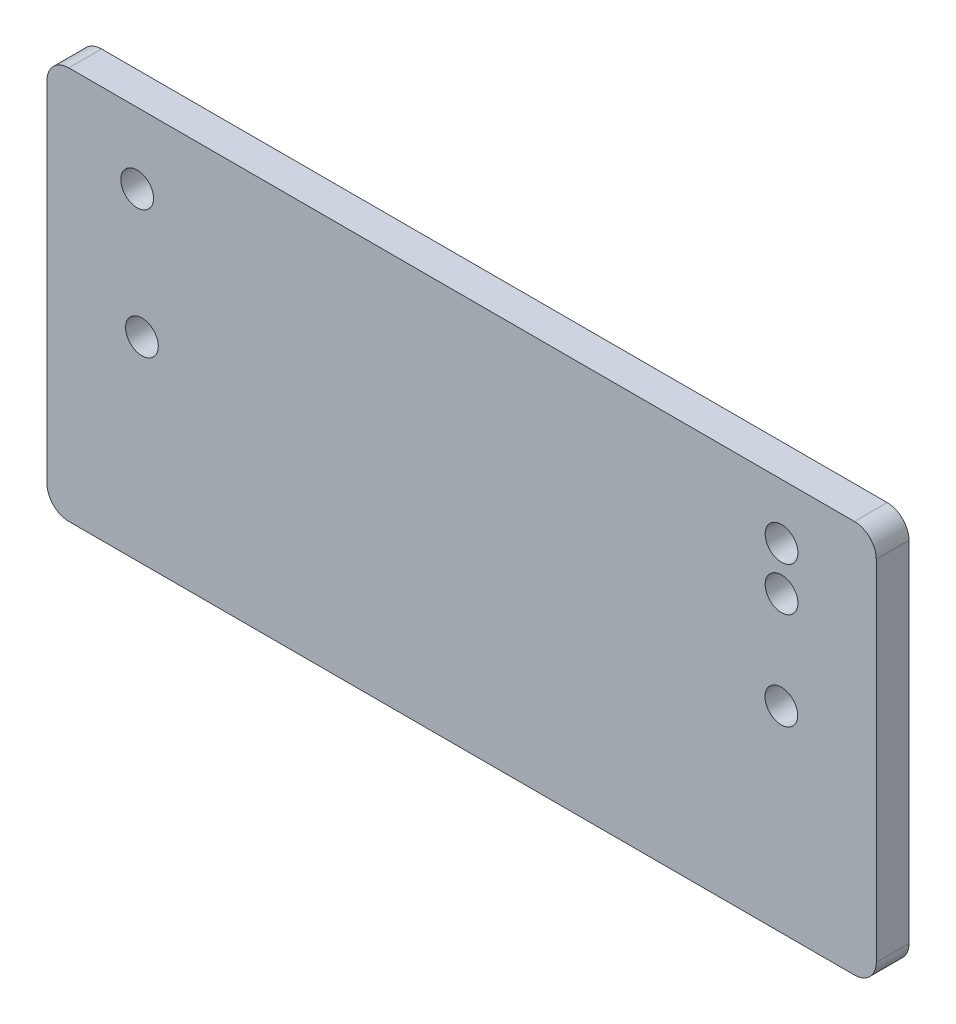
ISO-10303-21;
HEADER;
FILE_DESCRIPTION(('STEP AP214'),'2;1');
FILE_NAME('part.step','',(''),(''),'','','');
FILE_SCHEMA(('AUTOMOTIVE_DESIGN { 1 0 10303 214 1 1 1 1 }'));
ENDSEC;
DATA;
#1=APPLICATION_CONTEXT('core data for automotive mechanical design processes');
#2=APPLICATION_PROTOCOL_DEFINITION('international standard','automotive_design',2000,#1);
#3=PRODUCT_CONTEXT('',#1,'mechanical');
#4=PRODUCT('Part','Part','',(#3));
#5=PRODUCT_RELATED_PRODUCT_CATEGORY('part','',(#4));
#6=PRODUCT_DEFINITION_FORMATION('','',#4);
#7=PRODUCT_DEFINITION_CONTEXT('part definition',#1,'design');
#8=PRODUCT_DEFINITION('design','',#6,#7);
#9=PRODUCT_DEFINITION_SHAPE('','',#8);
#10=(LENGTH_UNIT() NAMED_UNIT(*) SI_UNIT(.MILLI.,.METRE.));
#11=(NAMED_UNIT(*) PLANE_ANGLE_UNIT() SI_UNIT($,.RADIAN.));
#12=(NAMED_UNIT(*) SI_UNIT($,.STERADIAN.) SOLID_ANGLE_UNIT());
#13=UNCERTAINTY_MEASURE_WITH_UNIT(LENGTH_MEASURE(1.E-05),#10,'distance_accuracy_value','');
#14=(GEOMETRIC_REPRESENTATION_CONTEXT(3) GLOBAL_UNCERTAINTY_ASSIGNED_CONTEXT((#13)) GLOBAL_UNIT_ASSIGNED_CONTEXT((#10,
#11,#12)) REPRESENTATION_CONTEXT('',''));
#15=CARTESIAN_POINT('',(0.,0.,0.));
#16=DIRECTION('',(0.,0.,1.));
#17=DIRECTION('',(1.,0.,0.));
#18=AXIS2_PLACEMENT_3D('',#15,#16,#17);
#19=CARTESIAN_POINT('',(40.6759171383149,-2.,3.));
#20=DIRECTION('',(0.,0.,-1.));
#21=DIRECTION('',(-1.,0.,0.));
#22=AXIS2_PLACEMENT_3D('',#19,#20,#21);
#23=CYLINDRICAL_SURFACE('',#22,2.);
#24=CARTESIAN_POINT('',(40.6759171383149,-2.,0.));
#25=DIRECTION('',(0.,0.,1.));
#26=DIRECTION('',(-1.,0.,0.));
#27=AXIS2_PLACEMENT_3D('',#24,#25,#26);
#28=CIRCLE('',#27,2.);
#29=CARTESIAN_POINT('',(42.6759171383149,-2.00000000000001,0.));
#30=VERTEX_POINT('',#29);
#31=CARTESIAN_POINT('',(40.6759171383149,0.,0.));
#32=VERTEX_POINT('',#31);
#33=EDGE_CURVE('E141',#30,#32,#28,.T.);
#34=ORIENTED_EDGE('',*,*,#33,.T.);
#35=DIRECTION('',(0.,0.,-1.));
#36=VECTOR('',#35,1.);
#37=CARTESIAN_POINT('',(40.6759171383149,0.,3.));
#38=LINE('',#37,#36);
#39=CARTESIAN_POINT('',(40.6759171383149,0.,3.));
#40=VERTEX_POINT('',#39);
#41=EDGE_CURVE('E11',#40,#32,#38,.T.);
#42=ORIENTED_EDGE('',*,*,#41,.F.);
#43=CARTESIAN_POINT('',(40.6759171383149,-2.,3.));
#44=DIRECTION('',(0.,0.,1.));
#45=DIRECTION('',(-1.,0.,0.));
#46=AXIS2_PLACEMENT_3D('',#43,#44,#45);
#47=CIRCLE('',#46,2.);
#48=CARTESIAN_POINT('',(42.6759171383149,-2.00000000000001,3.));
#49=VERTEX_POINT('',#48);
#50=EDGE_CURVE('E156',#49,#40,#47,.T.);
#51=ORIENTED_EDGE('',*,*,#50,.F.);
#52=DIRECTION('',(0.,0.,-1.));
#53=VECTOR('',#52,1.);
#54=CARTESIAN_POINT('',(42.6759171383149,-2.00000000000001,3.));
#55=LINE('',#54,#53);
#56=EDGE_CURVE('E137',#49,#30,#55,.T.);
#57=ORIENTED_EDGE('',*,*,#56,.T.);
#58=EDGE_LOOP('',(#34,#42,#51,#57));
#59=FACE_BOUND('',#58,.T.);
#60=ADVANCED_FACE('F45',(#59),#23,.T.);
#61=CARTESIAN_POINT('',(-31.3240828616851,0.,3.));
#62=DIRECTION('',(0.,-1.,0.));
#63=DIRECTION('',(0.,0.,-1.));
#64=AXIS2_PLACEMENT_3D('',#61,#62,#63);
#65=PLANE('',#64);
#66=DIRECTION('',(-1.,0.,0.));
#67=VECTOR('',#66,1.);
#68=CARTESIAN_POINT('',(-31.3240828616851,0.,0.));
#69=LINE('',#68,#67);
#70=CARTESIAN_POINT('',(-31.3240828616851,0.,0.));
#71=VERTEX_POINT('',#70);
#72=EDGE_CURVE('E144',#32,#71,#69,.T.);
#73=ORIENTED_EDGE('',*,*,#72,.T.);
#74=DIRECTION('',(0.,0.,-1.));
#75=VECTOR('',#74,1.);
#76=CARTESIAN_POINT('',(-31.3240828616851,0.,3.));
#77=LINE('',#76,#75);
#78=CARTESIAN_POINT('',(-31.3240828616851,0.,3.));
#79=VERTEX_POINT('',#78);
#80=EDGE_CURVE('E53',#79,#71,#77,.T.);
#81=ORIENTED_EDGE('',*,*,#80,.F.);
#82=DIRECTION('',(-1.,0.,0.));
#83=VECTOR('',#82,1.);
#84=CARTESIAN_POINT('',(-31.3240828616851,0.,3.));
#85=LINE('',#84,#83);
#86=EDGE_CURVE('E104',#40,#79,#85,.T.);
#87=ORIENTED_EDGE('',*,*,#86,.F.);
#88=ORIENTED_EDGE('',*,*,#41,.T.);
#89=EDGE_LOOP('',(#73,#81,#87,#88));
#90=FACE_BOUND('',#89,.T.);
#91=ADVANCED_FACE('F246',(#90),#65,.F.);
#92=CARTESIAN_POINT('',(-31.3240828616851,-2.,3.));
#93=DIRECTION('',(0.,0.,-1.));
#94=DIRECTION('',(-1.,0.,0.));
#95=AXIS2_PLACEMENT_3D('',#92,#93,#94);
#96=CYLINDRICAL_SURFACE('',#95,2.);
#97=CARTESIAN_POINT('',(-31.3240828616851,-2.,0.));
#98=DIRECTION('',(0.,0.,1.));
#99=DIRECTION('',(-1.,0.,0.));
#100=AXIS2_PLACEMENT_3D('',#97,#98,#99);
#101=CIRCLE('',#100,2.);
#102=CARTESIAN_POINT('',(-33.3240828616851,-2.00000000000001,0.));
#103=VERTEX_POINT('',#102);
#104=EDGE_CURVE('E147',#71,#103,#101,.T.);
#105=ORIENTED_EDGE('',*,*,#104,.T.);
#106=DIRECTION('',(0.,0.,-1.));
#107=VECTOR('',#106,1.);
#108=CARTESIAN_POINT('',(-33.3240828616851,-2.00000000000001,3.));
#109=LINE('',#108,#107);
#110=CARTESIAN_POINT('',(-33.3240828616851,-2.00000000000001,3.));
#111=VERTEX_POINT('',#110);
#112=EDGE_CURVE('E163',#111,#103,#109,.T.);
#113=ORIENTED_EDGE('',*,*,#112,.F.);
#114=CARTESIAN_POINT('',(-31.3240828616851,-2.,3.));
#115=DIRECTION('',(0.,0.,1.));
#116=DIRECTION('',(-1.,0.,0.));
#117=AXIS2_PLACEMENT_3D('',#114,#115,#116);
#118=CIRCLE('',#117,2.);
#119=EDGE_CURVE('E171',#79,#111,#118,.T.);
#120=ORIENTED_EDGE('',*,*,#119,.F.);
#121=ORIENTED_EDGE('',*,*,#80,.T.);
#122=EDGE_LOOP('',(#105,#113,#120,#121));
#123=FACE_BOUND('',#122,.T.);
#124=ADVANCED_FACE('F169',(#123),#96,.T.);
#125=CARTESIAN_POINT('',(-33.3240828616851,-2.00000000000001,3.));
#126=DIRECTION('',(1.,0.,0.));
#127=DIRECTION('',(0.,0.,-1.));
#128=AXIS2_PLACEMENT_3D('',#125,#126,#127);
#129=PLANE('',#128);
#130=DIRECTION('',(0.,-1.,0.));
#131=VECTOR('',#130,1.);
#132=CARTESIAN_POINT('',(-33.3240828616851,-2.00000000000001,0.));
#133=LINE('',#132,#131);
#134=CARTESIAN_POINT('',(-33.3240828616851,-34.,0.));
#135=VERTEX_POINT('',#134);
#136=EDGE_CURVE('E149',#103,#135,#133,.T.);
#137=ORIENTED_EDGE('',*,*,#136,.T.);
#138=DIRECTION('',(0.,0.,-1.));
#139=VECTOR('',#138,1.);
#140=CARTESIAN_POINT('',(-33.3240828616851,-34.,3.));
#141=LINE('',#140,#139);
#142=CARTESIAN_POINT('',(-33.3240828616851,-34.,3.));
#143=VERTEX_POINT('',#142);
#144=EDGE_CURVE('E160',#143,#135,#141,.T.);
#145=ORIENTED_EDGE('',*,*,#144,.F.);
#146=DIRECTION('',(0.,-1.,0.));
#147=VECTOR('',#146,1.);
#148=CARTESIAN_POINT('',(-33.3240828616851,-2.00000000000001,3.));
#149=LINE('',#148,#147);
#150=EDGE_CURVE('E183',#111,#143,#149,.T.);
#151=ORIENTED_EDGE('',*,*,#150,.F.);
#152=ORIENTED_EDGE('',*,*,#112,.T.);
#153=EDGE_LOOP('',(#137,#145,#151,#152));
#154=FACE_BOUND('',#153,.T.);
#155=ADVANCED_FACE('F179',(#154),#129,.F.);
#156=CARTESIAN_POINT('',(-31.3240828616851,-34.,3.));
#157=DIRECTION('',(0.,0.,-1.));
#158=DIRECTION('',(-1.,0.,0.));
#159=AXIS2_PLACEMENT_3D('',#156,#157,#158);
#160=CYLINDRICAL_SURFACE('',#159,2.);
#161=CARTESIAN_POINT('',(-31.3240828616851,-34.,0.));
#162=DIRECTION('',(0.,0.,1.));
#163=DIRECTION('',(-1.,0.,0.));
#164=AXIS2_PLACEMENT_3D('',#161,#162,#163);
#165=CIRCLE('',#164,2.);
#166=CARTESIAN_POINT('',(-31.3240828616851,-36.,0.));
#167=VERTEX_POINT('',#166);
#168=EDGE_CURVE('E151',#135,#167,#165,.T.);
#169=ORIENTED_EDGE('',*,*,#168,.T.);
#170=DIRECTION('',(0.,0.,-1.));
#171=VECTOR('',#170,1.);
#172=CARTESIAN_POINT('',(-31.3240828616851,-36.,3.));
#173=LINE('',#172,#171);
#174=CARTESIAN_POINT('',(-31.3240828616851,-36.,3.));
#175=VERTEX_POINT('',#174);
#176=EDGE_CURVE('E132',#175,#167,#173,.T.);
#177=ORIENTED_EDGE('',*,*,#176,.F.);
#178=CARTESIAN_POINT('',(-31.3240828616851,-34.,3.));
#179=DIRECTION('',(0.,0.,1.));
#180=DIRECTION('',(-1.,0.,0.));
#181=AXIS2_PLACEMENT_3D('',#178,#179,#180);
#182=CIRCLE('',#181,2.);
#183=EDGE_CURVE('E123',#143,#175,#182,.T.);
#184=ORIENTED_EDGE('',*,*,#183,.F.);
#185=ORIENTED_EDGE('',*,*,#144,.T.);
#186=EDGE_LOOP('',(#169,#177,#184,#185));
#187=FACE_BOUND('',#186,.T.);
#188=ADVANCED_FACE('F182',(#187),#160,.T.);
#189=CARTESIAN_POINT('',(-31.3240828616851,-36.,3.));
#190=DIRECTION('',(0.,1.,0.));
#191=DIRECTION('',(0.,0.,1.));
#192=AXIS2_PLACEMENT_3D('',#189,#190,#191);
#193=PLANE('',#192);
#194=DIRECTION('',(1.,0.,0.));
#195=VECTOR('',#194,1.);
#196=CARTESIAN_POINT('',(-31.3240828616851,-36.,0.));
#197=LINE('',#196,#195);
#198=CARTESIAN_POINT('',(40.6759171383149,-36.,0.));
#199=VERTEX_POINT('',#198);
#200=EDGE_CURVE('E131',#167,#199,#197,.T.);
#201=ORIENTED_EDGE('',*,*,#200,.T.);
#202=DIRECTION('',(0.,0.,-1.));
#203=VECTOR('',#202,1.);
#204=CARTESIAN_POINT('',(40.6759171383149,-36.,3.));
#205=LINE('',#204,#203);
#206=CARTESIAN_POINT('',(40.6759171383149,-36.,3.));
#207=VERTEX_POINT('',#206);
#208=EDGE_CURVE('E128',#207,#199,#205,.T.);
#209=ORIENTED_EDGE('',*,*,#208,.F.);
#210=DIRECTION('',(1.,0.,0.));
#211=VECTOR('',#210,1.);
#212=CARTESIAN_POINT('',(-31.3240828616851,-36.,3.));
#213=LINE('',#212,#211);
#214=EDGE_CURVE('E117',#175,#207,#213,.T.);
#215=ORIENTED_EDGE('',*,*,#214,.F.);
#216=ORIENTED_EDGE('',*,*,#176,.T.);
#217=EDGE_LOOP('',(#201,#209,#215,#216));
#218=FACE_BOUND('',#217,.T.);
#219=ADVANCED_FACE('F129',(#218),#193,.F.);
#220=CARTESIAN_POINT('',(40.6759171383149,-34.,3.));
#221=DIRECTION('',(0.,0.,-1.));
#222=DIRECTION('',(-1.,0.,0.));
#223=AXIS2_PLACEMENT_3D('',#220,#221,#222);
#224=CYLINDRICAL_SURFACE('',#223,2.);
#225=CARTESIAN_POINT('',(40.6759171383149,-34.,0.));
#226=DIRECTION('',(0.,0.,1.));
#227=DIRECTION('',(-1.,0.,0.));
#228=AXIS2_PLACEMENT_3D('',#225,#226,#227);
#229=CIRCLE('',#228,2.);
#230=CARTESIAN_POINT('',(42.6759171383149,-34.,0.));
#231=VERTEX_POINT('',#230);
#232=EDGE_CURVE('E90',#199,#231,#229,.T.);
#233=ORIENTED_EDGE('',*,*,#232,.T.);
#234=DIRECTION('',(0.,0.,-1.));
#235=VECTOR('',#234,1.);
#236=CARTESIAN_POINT('',(42.6759171383149,-34.,3.));
#237=LINE('',#236,#235);
#238=CARTESIAN_POINT('',(42.6759171383149,-34.,3.));
#239=VERTEX_POINT('',#238);
#240=EDGE_CURVE('E133',#239,#231,#237,.T.);
#241=ORIENTED_EDGE('',*,*,#240,.F.);
#242=CARTESIAN_POINT('',(40.6759171383149,-34.,3.));
#243=DIRECTION('',(0.,0.,1.));
#244=DIRECTION('',(-1.,0.,0.));
#245=AXIS2_PLACEMENT_3D('',#242,#243,#244);
#246=CIRCLE('',#245,2.);
#247=EDGE_CURVE('E121',#207,#239,#246,.T.);
#248=ORIENTED_EDGE('',*,*,#247,.F.);
#249=ORIENTED_EDGE('',*,*,#208,.T.);
#250=EDGE_LOOP('',(#233,#241,#248,#249));
#251=FACE_BOUND('',#250,.T.);
#252=ADVANCED_FACE('F135',(#251),#224,.T.);
#253=CARTESIAN_POINT('',(42.6759171383149,-34.,3.));
#254=DIRECTION('',(-1.,0.,0.));
#255=DIRECTION('',(0.,0.,1.));
#256=AXIS2_PLACEMENT_3D('',#253,#254,#255);
#257=PLANE('',#256);
#258=DIRECTION('',(0.,1.,0.));
#259=VECTOR('',#258,1.);
#260=CARTESIAN_POINT('',(42.6759171383149,-34.,0.));
#261=LINE('',#260,#259);
#262=EDGE_CURVE('E96',#231,#30,#261,.T.);
#263=ORIENTED_EDGE('',*,*,#262,.T.);
#264=ORIENTED_EDGE('',*,*,#56,.F.);
#265=DIRECTION('',(0.,1.,0.));
#266=VECTOR('',#265,1.);
#267=CARTESIAN_POINT('',(42.6759171383149,-34.,3.));
#268=LINE('',#267,#266);
#269=EDGE_CURVE('E61',#239,#49,#268,.T.);
#270=ORIENTED_EDGE('',*,*,#269,.F.);
#271=ORIENTED_EDGE('',*,*,#240,.T.);
#272=EDGE_LOOP('',(#263,#264,#270,#271));
#273=FACE_BOUND('',#272,.T.);
#274=ADVANCED_FACE('F223',(#273),#257,.F.);
#275=CARTESIAN_POINT('',(40.6759171383149,-2.,3.));
#276=DIRECTION('',(0.,0.,-1.));
#277=DIRECTION('',(-1.,0.,0.));
#278=AXIS2_PLACEMENT_3D('',#275,#276,#277);
#279=PLANE('',#278);
#280=CARTESIAN_POINT('',(33.9759171383149,-18.,3.));
#281=DIRECTION('',(0.,0.,1.));
#282=DIRECTION('',(1.,0.,0.));
#283=AXIS2_PLACEMENT_3D('',#280,#281,#282);
#284=CIRCLE('',#283,1.5);
#285=CARTESIAN_POINT('',(35.4759171383149,-18.,3.));
#286=VERTEX_POINT('',#285);
#287=EDGE_CURVE('E192',#286,#286,#284,.T.);
#288=ORIENTED_EDGE('',*,*,#287,.F.);
#289=EDGE_LOOP('',(#288));
#290=FACE_BOUND('',#289,.T.);
#291=CARTESIAN_POINT('',(-25.0625568934553,-6.477,3.));
#292=DIRECTION('',(0.,0.,1.));
#293=DIRECTION('',(1.,0.,0.));
#294=AXIS2_PLACEMENT_3D('',#291,#292,#293);
#295=CIRCLE('',#294,1.5);
#296=CARTESIAN_POINT('',(-23.5625568934553,-6.477,3.));
#297=VERTEX_POINT('',#296);
#298=EDGE_CURVE('E198',#297,#297,#295,.T.);
#299=ORIENTED_EDGE('',*,*,#298,.F.);
#300=EDGE_LOOP('',(#299));
#301=FACE_BOUND('',#300,.T.);
#302=CARTESIAN_POINT('',(33.9924431065447,-5.08,3.));
#303=DIRECTION('',(0.,0.,1.));
#304=DIRECTION('',(1.,0.,0.));
#305=AXIS2_PLACEMENT_3D('',#302,#303,#304);
#306=CIRCLE('',#305,1.5);
#307=CARTESIAN_POINT('',(35.4924431065447,-5.08,3.));
#308=VERTEX_POINT('',#307);
#309=EDGE_CURVE('E199',#308,#308,#306,.T.);
#310=ORIENTED_EDGE('',*,*,#309,.F.);
#311=EDGE_LOOP('',(#310));
#312=FACE_BOUND('',#311,.T.);
#313=CARTESIAN_POINT('',(33.9924431065447,-9.08,3.));
#314=DIRECTION('',(0.,0.,1.));
#315=DIRECTION('',(1.,0.,0.));
#316=AXIS2_PLACEMENT_3D('',#313,#314,#315);
#317=CIRCLE('',#316,1.5);
#318=CARTESIAN_POINT('',(35.4924431065447,-9.08,3.));
#319=VERTEX_POINT('',#318);
#320=EDGE_CURVE('E210',#319,#319,#317,.T.);
#321=ORIENTED_EDGE('',*,*,#320,.F.);
#322=EDGE_LOOP('',(#321));
#323=FACE_BOUND('',#322,.T.);
#324=CARTESIAN_POINT('',(-24.6240828616851,-18.,3.));
#325=DIRECTION('',(0.,0.,1.));
#326=DIRECTION('',(1.,0.,0.));
#327=AXIS2_PLACEMENT_3D('',#324,#325,#326);
#328=CIRCLE('',#327,1.5);
#329=CARTESIAN_POINT('',(-23.1240828616851,-18.,3.));
#330=VERTEX_POINT('',#329);
#331=EDGE_CURVE('E189',#330,#330,#328,.T.);
#332=ORIENTED_EDGE('',*,*,#331,.F.);
#333=EDGE_LOOP('',(#332));
#334=FACE_BOUND('',#333,.T.);
#335=ORIENTED_EDGE('',*,*,#50,.T.);
#336=ORIENTED_EDGE('',*,*,#86,.T.);
#337=ORIENTED_EDGE('',*,*,#119,.T.);
#338=ORIENTED_EDGE('',*,*,#150,.T.);
#339=ORIENTED_EDGE('',*,*,#183,.T.);
#340=ORIENTED_EDGE('',*,*,#214,.T.);
#341=ORIENTED_EDGE('',*,*,#247,.T.);
#342=ORIENTED_EDGE('',*,*,#269,.T.);
#343=EDGE_LOOP('',(#335,#336,#337,#338,#339,#340,#341,#342));
#344=FACE_BOUND('',#343,.T.);
#345=ADVANCED_FACE('F119',(#290,#301,#312,#323,#334,#344),#279,.F.);
#346=CARTESIAN_POINT('',(40.6759171383149,-2.,0.));
#347=DIRECTION('',(0.,0.,-1.));
#348=DIRECTION('',(-1.,0.,0.));
#349=AXIS2_PLACEMENT_3D('',#346,#347,#348);
#350=PLANE('',#349);
#351=CARTESIAN_POINT('',(33.9759171383149,-18.,0.));
#352=DIRECTION('',(0.,0.,1.));
#353=DIRECTION('',(1.,0.,0.));
#354=AXIS2_PLACEMENT_3D('',#351,#352,#353);
#355=CIRCLE('',#354,1.5);
#356=CARTESIAN_POINT('',(35.4759171383149,-18.,0.));
#357=VERTEX_POINT('',#356);
#358=EDGE_CURVE('E202',#357,#357,#355,.T.);
#359=ORIENTED_EDGE('',*,*,#358,.T.);
#360=EDGE_LOOP('',(#359));
#361=FACE_BOUND('',#360,.T.);
#362=CARTESIAN_POINT('',(-25.0625568934553,-6.477,0.));
#363=DIRECTION('',(0.,0.,1.));
#364=DIRECTION('',(1.,0.,0.));
#365=AXIS2_PLACEMENT_3D('',#362,#363,#364);
#366=CIRCLE('',#365,1.5);
#367=CARTESIAN_POINT('',(-23.5625568934553,-6.477,0.));
#368=VERTEX_POINT('',#367);
#369=EDGE_CURVE('E195',#368,#368,#366,.T.);
#370=ORIENTED_EDGE('',*,*,#369,.T.);
#371=EDGE_LOOP('',(#370));
#372=FACE_BOUND('',#371,.T.);
#373=CARTESIAN_POINT('',(33.9924431065447,-5.08,0.));
#374=DIRECTION('',(0.,0.,1.));
#375=DIRECTION('',(1.,0.,0.));
#376=AXIS2_PLACEMENT_3D('',#373,#374,#375);
#377=CIRCLE('',#376,1.5);
#378=CARTESIAN_POINT('',(35.4924431065447,-5.08,0.));
#379=VERTEX_POINT('',#378);
#380=EDGE_CURVE('E213',#379,#379,#377,.T.);
#381=ORIENTED_EDGE('',*,*,#380,.T.);
#382=EDGE_LOOP('',(#381));
#383=FACE_BOUND('',#382,.T.);
#384=CARTESIAN_POINT('',(33.9924431065447,-9.08,0.));
#385=DIRECTION('',(0.,0.,1.));
#386=DIRECTION('',(1.,0.,0.));
#387=AXIS2_PLACEMENT_3D('',#384,#385,#386);
#388=CIRCLE('',#387,1.5);
#389=CARTESIAN_POINT('',(35.4924431065447,-9.08,0.));
#390=VERTEX_POINT('',#389);
#391=EDGE_CURVE('E207',#390,#390,#388,.T.);
#392=ORIENTED_EDGE('',*,*,#391,.T.);
#393=EDGE_LOOP('',(#392));
#394=FACE_BOUND('',#393,.T.);
#395=CARTESIAN_POINT('',(-24.6240828616851,-18.,0.));
#396=DIRECTION('',(0.,0.,1.));
#397=DIRECTION('',(1.,0.,0.));
#398=AXIS2_PLACEMENT_3D('',#395,#396,#397);
#399=CIRCLE('',#398,1.5);
#400=CARTESIAN_POINT('',(-23.1240828616851,-18.,0.));
#401=VERTEX_POINT('',#400);
#402=EDGE_CURVE('E145',#401,#401,#399,.T.);
#403=ORIENTED_EDGE('',*,*,#402,.T.);
#404=EDGE_LOOP('',(#403));
#405=FACE_BOUND('',#404,.T.);
#406=ORIENTED_EDGE('',*,*,#33,.F.);
#407=ORIENTED_EDGE('',*,*,#262,.F.);
#408=ORIENTED_EDGE('',*,*,#232,.F.);
#409=ORIENTED_EDGE('',*,*,#200,.F.);
#410=ORIENTED_EDGE('',*,*,#168,.F.);
#411=ORIENTED_EDGE('',*,*,#136,.F.);
#412=ORIENTED_EDGE('',*,*,#104,.F.);
#413=ORIENTED_EDGE('',*,*,#72,.F.);
#414=EDGE_LOOP('',(#406,#407,#408,#409,#410,#411,#412,#413));
#415=FACE_BOUND('',#414,.T.);
#416=ADVANCED_FACE('F175',(#361,#372,#383,#394,#405,#415),#350,.T.);
#417=CARTESIAN_POINT('',(-24.6240828616851,-18.,0.));
#418=DIRECTION('',(0.,0.,1.));
#419=DIRECTION('',(1.,0.,0.));
#420=AXIS2_PLACEMENT_3D('',#417,#418,#419);
#421=CYLINDRICAL_SURFACE('',#420,1.5);
#422=ORIENTED_EDGE('',*,*,#402,.F.);
#423=EDGE_LOOP('',(#422));
#424=FACE_BOUND('',#423,.T.);
#425=ORIENTED_EDGE('',*,*,#331,.T.);
#426=EDGE_LOOP('',(#425));
#427=FACE_BOUND('',#426,.T.);
#428=ADVANCED_FACE('F230',(#424,#427),#421,.F.);
#429=CARTESIAN_POINT('',(33.9924431065447,-9.08,0.));
#430=DIRECTION('',(0.,0.,1.));
#431=DIRECTION('',(1.,0.,0.));
#432=AXIS2_PLACEMENT_3D('',#429,#430,#431);
#433=CYLINDRICAL_SURFACE('',#432,1.5);
#434=ORIENTED_EDGE('',*,*,#391,.F.);
#435=EDGE_LOOP('',(#434));
#436=FACE_BOUND('',#435,.T.);
#437=ORIENTED_EDGE('',*,*,#320,.T.);
#438=EDGE_LOOP('',(#437));
#439=FACE_BOUND('',#438,.T.);
#440=ADVANCED_FACE('F232',(#436,#439),#433,.F.);
#441=CARTESIAN_POINT('',(33.9924431065447,-5.08,0.));
#442=DIRECTION('',(0.,0.,1.));
#443=DIRECTION('',(1.,0.,0.));
#444=AXIS2_PLACEMENT_3D('',#441,#442,#443);
#445=CYLINDRICAL_SURFACE('',#444,1.5);
#446=ORIENTED_EDGE('',*,*,#380,.F.);
#447=EDGE_LOOP('',(#446));
#448=FACE_BOUND('',#447,.T.);
#449=ORIENTED_EDGE('',*,*,#309,.T.);
#450=EDGE_LOOP('',(#449));
#451=FACE_BOUND('',#450,.T.);
#452=ADVANCED_FACE('F219',(#448,#451),#445,.F.);
#453=CARTESIAN_POINT('',(-25.0625568934553,-6.477,0.));
#454=DIRECTION('',(0.,0.,1.));
#455=DIRECTION('',(1.,0.,0.));
#456=AXIS2_PLACEMENT_3D('',#453,#454,#455);
#457=CYLINDRICAL_SURFACE('',#456,1.5);
#458=ORIENTED_EDGE('',*,*,#369,.F.);
#459=EDGE_LOOP('',(#458));
#460=FACE_BOUND('',#459,.T.);
#461=ORIENTED_EDGE('',*,*,#298,.T.);
#462=EDGE_LOOP('',(#461));
#463=FACE_BOUND('',#462,.T.);
#464=ADVANCED_FACE('F327',(#460,#463),#457,.F.);
#465=CARTESIAN_POINT('',(33.9759171383149,-18.,0.));
#466=DIRECTION('',(0.,0.,1.));
#467=DIRECTION('',(1.,0.,0.));
#468=AXIS2_PLACEMENT_3D('',#465,#466,#467);
#469=CYLINDRICAL_SURFACE('',#468,1.5);
#470=ORIENTED_EDGE('',*,*,#358,.F.);
#471=EDGE_LOOP('',(#470));
#472=FACE_BOUND('',#471,.T.);
#473=ORIENTED_EDGE('',*,*,#287,.T.);
#474=EDGE_LOOP('',(#473));
#475=FACE_BOUND('',#474,.T.);
#476=ADVANCED_FACE('F337',(#472,#475),#469,.F.);
#477=CLOSED_SHELL('',(#60,#91,#124,#155,#188,#219,#252,#274,#345,#416,#428,#440,#452,#464,#476));
#478=MANIFOLD_SOLID_BREP('B2',#477);
#479=ADVANCED_BREP_SHAPE_REPRESENTATION('',(#18,#478),#14);
#480=SHAPE_DEFINITION_REPRESENTATION(#9,#479);
ENDSEC;
END-ISO-10303-21;
